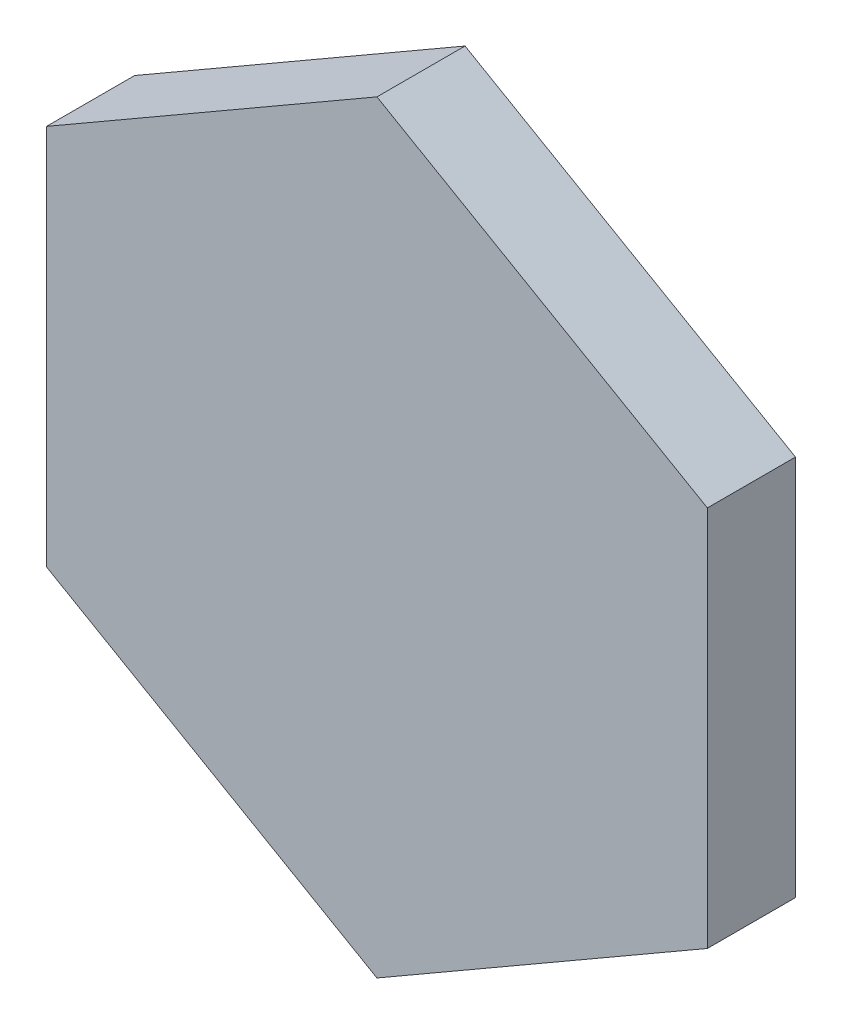
ISO-10303-21;
HEADER;
FILE_DESCRIPTION(('STEP AP214'),'2;1');
FILE_NAME('part.step','',(''),(''),'','','');
FILE_SCHEMA(('AUTOMOTIVE_DESIGN { 1 0 10303 214 1 1 1 1 }'));
ENDSEC;
DATA;
#1=APPLICATION_CONTEXT('core data for automotive mechanical design processes');
#2=APPLICATION_PROTOCOL_DEFINITION('international standard','automotive_design',2000,#1);
#3=PRODUCT_CONTEXT('',#1,'mechanical');
#4=PRODUCT('Part','Part','',(#3));
#5=PRODUCT_RELATED_PRODUCT_CATEGORY('part','',(#4));
#6=PRODUCT_DEFINITION_FORMATION('','',#4);
#7=PRODUCT_DEFINITION_CONTEXT('part definition',#1,'design');
#8=PRODUCT_DEFINITION('design','',#6,#7);
#9=PRODUCT_DEFINITION_SHAPE('','',#8);
#10=(LENGTH_UNIT() NAMED_UNIT(*) SI_UNIT(.MILLI.,.METRE.));
#11=(NAMED_UNIT(*) PLANE_ANGLE_UNIT() SI_UNIT($,.RADIAN.));
#12=(NAMED_UNIT(*) SI_UNIT($,.STERADIAN.) SOLID_ANGLE_UNIT());
#13=UNCERTAINTY_MEASURE_WITH_UNIT(LENGTH_MEASURE(1.E-05),#10,'distance_accuracy_value','');
#14=(GEOMETRIC_REPRESENTATION_CONTEXT(3) GLOBAL_UNCERTAINTY_ASSIGNED_CONTEXT((#13)) GLOBAL_UNIT_ASSIGNED_CONTEXT((#10,
#11,#12)) REPRESENTATION_CONTEXT('',''));
#15=CARTESIAN_POINT('',(0.,0.,0.));
#16=DIRECTION('',(0.,0.,1.));
#17=DIRECTION('',(1.,0.,0.));
#18=AXIS2_PLACEMENT_3D('',#15,#16,#17);
#19=CARTESIAN_POINT('',(75.,-43.3012701892219,20.));
#20=DIRECTION('',(-1.,0.,0.));
#21=DIRECTION('',(0.,0.,1.));
#22=AXIS2_PLACEMENT_3D('',#19,#20,#21);
#23=PLANE('',#22);
#24=DIRECTION('',(0.,1.,0.));
#25=VECTOR('',#24,1.);
#26=CARTESIAN_POINT('',(75.,-43.3012701892219,0.));
#27=LINE('',#26,#25);
#28=CARTESIAN_POINT('',(75.,-43.3012701892219,0.));
#29=VERTEX_POINT('',#28);
#30=CARTESIAN_POINT('',(75.,43.3012701892219,0.));
#31=VERTEX_POINT('',#30);
#32=EDGE_CURVE('E117',#29,#31,#27,.T.);
#33=ORIENTED_EDGE('',*,*,#32,.T.);
#34=DIRECTION('',(0.,0.,-1.));
#35=VECTOR('',#34,1.);
#36=CARTESIAN_POINT('',(75.,43.3012701892219,20.));
#37=LINE('',#36,#35);
#38=CARTESIAN_POINT('',(75.,43.3012701892219,20.));
#39=VERTEX_POINT('',#38);
#40=EDGE_CURVE('E11',#39,#31,#37,.T.);
#41=ORIENTED_EDGE('',*,*,#40,.F.);
#42=DIRECTION('',(0.,1.,0.));
#43=VECTOR('',#42,1.);
#44=CARTESIAN_POINT('',(75.,-43.3012701892219,20.));
#45=LINE('',#44,#43);
#46=CARTESIAN_POINT('',(75.,-43.3012701892219,20.));
#47=VERTEX_POINT('',#46);
#48=EDGE_CURVE('E127',#47,#39,#45,.T.);
#49=ORIENTED_EDGE('',*,*,#48,.F.);
#50=DIRECTION('',(0.,0.,-1.));
#51=VECTOR('',#50,1.);
#52=CARTESIAN_POINT('',(75.,-43.3012701892219,20.));
#53=LINE('',#52,#51);
#54=EDGE_CURVE('E113',#47,#29,#53,.T.);
#55=ORIENTED_EDGE('',*,*,#54,.T.);
#56=EDGE_LOOP('',(#33,#41,#49,#55));
#57=FACE_BOUND('',#56,.T.);
#58=ADVANCED_FACE('F33',(#57),#23,.F.);
#59=CARTESIAN_POINT('',(75.,43.3012701892219,20.));
#60=DIRECTION('',(-0.5,-0.866025403784439,0.));
#61=DIRECTION('',(0.866025403784439,-0.5,0.));
#62=AXIS2_PLACEMENT_3D('',#59,#60,#61);
#63=PLANE('',#62);
#64=DIRECTION('',(-0.866025403784438,0.5,0.));
#65=VECTOR('',#64,1.);
#66=CARTESIAN_POINT('',(75.,43.3012701892219,0.));
#67=LINE('',#66,#65);
#68=CARTESIAN_POINT('',(0.,86.6025403784439,0.));
#69=VERTEX_POINT('',#68);
#70=EDGE_CURVE('E120',#31,#69,#67,.T.);
#71=ORIENTED_EDGE('',*,*,#70,.T.);
#72=DIRECTION('',(0.,0.,-1.));
#73=VECTOR('',#72,1.);
#74=CARTESIAN_POINT('',(0.,86.6025403784439,20.));
#75=LINE('',#74,#73);
#76=CARTESIAN_POINT('',(0.,86.6025403784439,20.));
#77=VERTEX_POINT('',#76);
#78=EDGE_CURVE('E41',#77,#69,#75,.T.);
#79=ORIENTED_EDGE('',*,*,#78,.F.);
#80=DIRECTION('',(-0.866025403784438,0.5,0.));
#81=VECTOR('',#80,1.);
#82=CARTESIAN_POINT('',(75.,43.3012701892219,20.));
#83=LINE('',#82,#81);
#84=EDGE_CURVE('E86',#39,#77,#83,.T.);
#85=ORIENTED_EDGE('',*,*,#84,.F.);
#86=ORIENTED_EDGE('',*,*,#40,.T.);
#87=EDGE_LOOP('',(#71,#79,#85,#86));
#88=FACE_BOUND('',#87,.T.);
#89=ADVANCED_FACE('F151',(#88),#63,.F.);
#90=CARTESIAN_POINT('',(0.,86.6025403784439,20.));
#91=DIRECTION('',(0.5,-0.866025403784439,0.));
#92=DIRECTION('',(0.866025403784439,0.5,0.));
#93=AXIS2_PLACEMENT_3D('',#90,#91,#92);
#94=PLANE('',#93);
#95=DIRECTION('',(-0.866025403784439,-0.5,0.));
#96=VECTOR('',#95,1.);
#97=CARTESIAN_POINT('',(0.,86.6025403784439,0.));
#98=LINE('',#97,#96);
#99=CARTESIAN_POINT('',(-75.,43.301270189222,0.));
#100=VERTEX_POINT('',#99);
#101=EDGE_CURVE('E122',#69,#100,#98,.T.);
#102=ORIENTED_EDGE('',*,*,#101,.T.);
#103=DIRECTION('',(0.,0.,-1.));
#104=VECTOR('',#103,1.);
#105=CARTESIAN_POINT('',(-75.,43.301270189222,20.));
#106=LINE('',#105,#104);
#107=CARTESIAN_POINT('',(-75.,43.301270189222,20.));
#108=VERTEX_POINT('',#107);
#109=EDGE_CURVE('E108',#108,#100,#106,.T.);
#110=ORIENTED_EDGE('',*,*,#109,.F.);
#111=DIRECTION('',(-0.866025403784439,-0.5,0.));
#112=VECTOR('',#111,1.);
#113=CARTESIAN_POINT('',(0.,86.6025403784439,20.));
#114=LINE('',#113,#112);
#115=EDGE_CURVE('E99',#77,#108,#114,.T.);
#116=ORIENTED_EDGE('',*,*,#115,.F.);
#117=ORIENTED_EDGE('',*,*,#78,.T.);
#118=EDGE_LOOP('',(#102,#110,#116,#117));
#119=FACE_BOUND('',#118,.T.);
#120=ADVANCED_FACE('F133',(#119),#94,.F.);
#121=CARTESIAN_POINT('',(-75.,43.301270189222,20.));
#122=DIRECTION('',(1.,0.,0.));
#123=DIRECTION('',(0.,0.,-1.));
#124=AXIS2_PLACEMENT_3D('',#121,#122,#123);
#125=PLANE('',#124);
#126=DIRECTION('',(0.,-1.,0.));
#127=VECTOR('',#126,1.);
#128=CARTESIAN_POINT('',(-75.,43.301270189222,0.));
#129=LINE('',#128,#127);
#130=CARTESIAN_POINT('',(-75.,-43.3012701892219,0.));
#131=VERTEX_POINT('',#130);
#132=EDGE_CURVE('E107',#100,#131,#129,.T.);
#133=ORIENTED_EDGE('',*,*,#132,.T.);
#134=DIRECTION('',(0.,0.,-1.));
#135=VECTOR('',#134,1.);
#136=CARTESIAN_POINT('',(-75.,-43.3012701892219,20.));
#137=LINE('',#136,#135);
#138=CARTESIAN_POINT('',(-75.,-43.3012701892219,20.));
#139=VERTEX_POINT('',#138);
#140=EDGE_CURVE('E104',#139,#131,#137,.T.);
#141=ORIENTED_EDGE('',*,*,#140,.F.);
#142=DIRECTION('',(0.,-1.,0.));
#143=VECTOR('',#142,1.);
#144=CARTESIAN_POINT('',(-75.,43.301270189222,20.));
#145=LINE('',#144,#143);
#146=EDGE_CURVE('E93',#108,#139,#145,.T.);
#147=ORIENTED_EDGE('',*,*,#146,.F.);
#148=ORIENTED_EDGE('',*,*,#109,.T.);
#149=EDGE_LOOP('',(#133,#141,#147,#148));
#150=FACE_BOUND('',#149,.T.);
#151=ADVANCED_FACE('F105',(#150),#125,.F.);
#152=CARTESIAN_POINT('',(-75.,-43.3012701892219,20.));
#153=DIRECTION('',(0.5,0.866025403784439,0.));
#154=DIRECTION('',(-0.866025403784439,0.5,0.));
#155=AXIS2_PLACEMENT_3D('',#152,#153,#154);
#156=PLANE('',#155);
#157=DIRECTION('',(0.866025403784439,-0.5,0.));
#158=VECTOR('',#157,1.);
#159=CARTESIAN_POINT('',(-75.,-43.3012701892219,0.));
#160=LINE('',#159,#158);
#161=CARTESIAN_POINT('',(0.,-86.6025403784439,0.));
#162=VERTEX_POINT('',#161);
#163=EDGE_CURVE('E72',#131,#162,#160,.T.);
#164=ORIENTED_EDGE('',*,*,#163,.T.);
#165=DIRECTION('',(0.,0.,-1.));
#166=VECTOR('',#165,1.);
#167=CARTESIAN_POINT('',(0.,-86.6025403784439,20.));
#168=LINE('',#167,#166);
#169=CARTESIAN_POINT('',(0.,-86.6025403784439,20.));
#170=VERTEX_POINT('',#169);
#171=EDGE_CURVE('E109',#170,#162,#168,.T.);
#172=ORIENTED_EDGE('',*,*,#171,.F.);
#173=DIRECTION('',(0.866025403784439,-0.5,0.));
#174=VECTOR('',#173,1.);
#175=CARTESIAN_POINT('',(-75.,-43.3012701892219,20.));
#176=LINE('',#175,#174);
#177=EDGE_CURVE('E97',#139,#170,#176,.T.);
#178=ORIENTED_EDGE('',*,*,#177,.F.);
#179=ORIENTED_EDGE('',*,*,#140,.T.);
#180=EDGE_LOOP('',(#164,#172,#178,#179));
#181=FACE_BOUND('',#180,.T.);
#182=ADVANCED_FACE('F111',(#181),#156,.F.);
#183=CARTESIAN_POINT('',(0.,-86.6025403784439,20.));
#184=DIRECTION('',(-0.5,0.866025403784439,0.));
#185=DIRECTION('',(-0.866025403784439,-0.5,0.));
#186=AXIS2_PLACEMENT_3D('',#183,#184,#185);
#187=PLANE('',#186);
#188=DIRECTION('',(0.866025403784439,0.5,0.));
#189=VECTOR('',#188,1.);
#190=CARTESIAN_POINT('',(0.,-86.6025403784439,0.));
#191=LINE('',#190,#189);
#192=EDGE_CURVE('E78',#162,#29,#191,.T.);
#193=ORIENTED_EDGE('',*,*,#192,.T.);
#194=ORIENTED_EDGE('',*,*,#54,.F.);
#195=DIRECTION('',(0.866025403784439,0.5,0.));
#196=VECTOR('',#195,1.);
#197=CARTESIAN_POINT('',(0.,-86.6025403784439,20.));
#198=LINE('',#197,#196);
#199=EDGE_CURVE('E49',#170,#47,#198,.T.);
#200=ORIENTED_EDGE('',*,*,#199,.F.);
#201=ORIENTED_EDGE('',*,*,#171,.T.);
#202=EDGE_LOOP('',(#193,#194,#200,#201));
#203=FACE_BOUND('',#202,.T.);
#204=ADVANCED_FACE('F140',(#203),#187,.F.);
#205=CARTESIAN_POINT('',(0.,0.,20.));
#206=DIRECTION('',(0.,0.,1.));
#207=DIRECTION('',(1.,0.,0.));
#208=AXIS2_PLACEMENT_3D('',#205,#206,#207);
#209=PLANE('',#208);
#210=ORIENTED_EDGE('',*,*,#48,.T.);
#211=ORIENTED_EDGE('',*,*,#84,.T.);
#212=ORIENTED_EDGE('',*,*,#115,.T.);
#213=ORIENTED_EDGE('',*,*,#146,.T.);
#214=ORIENTED_EDGE('',*,*,#177,.T.);
#215=ORIENTED_EDGE('',*,*,#199,.T.);
#216=EDGE_LOOP('',(#210,#211,#212,#213,#214,#215));
#217=FACE_BOUND('',#216,.T.);
#218=ADVANCED_FACE('F95',(#217),#209,.T.);
#219=CARTESIAN_POINT('',(0.,0.,0.));
#220=DIRECTION('',(0.,0.,1.));
#221=DIRECTION('',(1.,0.,0.));
#222=AXIS2_PLACEMENT_3D('',#219,#220,#221);
#223=PLANE('',#222);
#224=ORIENTED_EDGE('',*,*,#32,.F.);
#225=ORIENTED_EDGE('',*,*,#192,.F.);
#226=ORIENTED_EDGE('',*,*,#163,.F.);
#227=ORIENTED_EDGE('',*,*,#132,.F.);
#228=ORIENTED_EDGE('',*,*,#101,.F.);
#229=ORIENTED_EDGE('',*,*,#70,.F.);
#230=EDGE_LOOP('',(#224,#225,#226,#227,#228,#229));
#231=FACE_BOUND('',#230,.T.);
#232=ADVANCED_FACE('F136',(#231),#223,.F.);
#233=CLOSED_SHELL('',(#58,#89,#120,#151,#182,#204,#218,#232));
#234=MANIFOLD_SOLID_BREP('B2',#233);
#235=ADVANCED_BREP_SHAPE_REPRESENTATION('',(#18,#234),#14);
#236=SHAPE_DEFINITION_REPRESENTATION(#9,#235);
ENDSEC;
END-ISO-10303-21;
